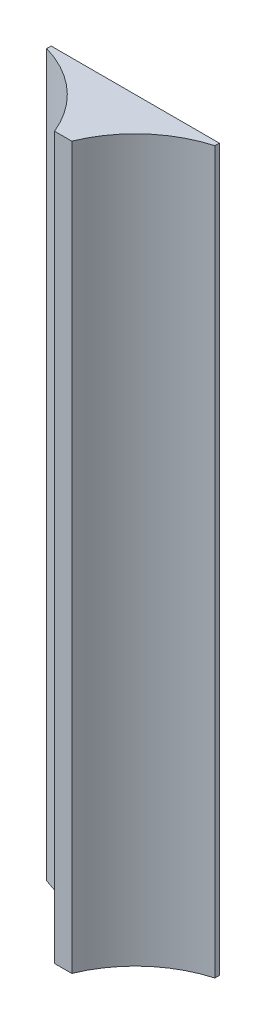
ISO-10303-21;
HEADER;
FILE_DESCRIPTION(('STEP AP214'),'2;1');
FILE_NAME('part.step','',(''),(''),'','','');
FILE_SCHEMA(('AUTOMOTIVE_DESIGN { 1 0 10303 214 1 1 1 1 }'));
ENDSEC;
DATA;
#1=APPLICATION_CONTEXT('core data for automotive mechanical design processes');
#2=APPLICATION_PROTOCOL_DEFINITION('international standard','automotive_design',2000,#1);
#3=PRODUCT_CONTEXT('',#1,'mechanical');
#4=PRODUCT('Part','Part','',(#3));
#5=PRODUCT_RELATED_PRODUCT_CATEGORY('part','',(#4));
#6=PRODUCT_DEFINITION_FORMATION('','',#4);
#7=PRODUCT_DEFINITION_CONTEXT('part definition',#1,'design');
#8=PRODUCT_DEFINITION('design','',#6,#7);
#9=PRODUCT_DEFINITION_SHAPE('','',#8);
#10=(LENGTH_UNIT() NAMED_UNIT(*) SI_UNIT(.MILLI.,.METRE.));
#11=(NAMED_UNIT(*) PLANE_ANGLE_UNIT() SI_UNIT($,.RADIAN.));
#12=(NAMED_UNIT(*) SI_UNIT($,.STERADIAN.) SOLID_ANGLE_UNIT());
#13=UNCERTAINTY_MEASURE_WITH_UNIT(LENGTH_MEASURE(1.E-05),#10,'distance_accuracy_value','');
#14=(GEOMETRIC_REPRESENTATION_CONTEXT(3) GLOBAL_UNCERTAINTY_ASSIGNED_CONTEXT((#13)) GLOBAL_UNIT_ASSIGNED_CONTEXT((#10,
#11,#12)) REPRESENTATION_CONTEXT('',''));
#15=CARTESIAN_POINT('',(0.,0.,0.));
#16=DIRECTION('',(0.,0.,1.));
#17=DIRECTION('',(1.,0.,0.));
#18=AXIS2_PLACEMENT_3D('',#15,#16,#17);
#19=CARTESIAN_POINT('',(-9.65,60.,3.65));
#20=DIRECTION('',(0.,-1.,0.));
#21=DIRECTION('',(0.,0.,-1.));
#22=AXIS2_PLACEMENT_3D('',#19,#20,#21);
#23=CYLINDRICAL_SURFACE('',#22,9.65);
#24=CARTESIAN_POINT('',(-9.65,0.,3.65));
#25=DIRECTION('',(0.,-1.,0.));
#26=DIRECTION('',(0.,0.,-1.));
#27=AXIS2_PLACEMENT_3D('',#24,#25,#26);
#28=CIRCLE('',#27,9.65);
#29=CARTESIAN_POINT('',(-7.,0.,-5.62900856772964));
#30=VERTEX_POINT('',#29);
#31=CARTESIAN_POINT('',(-0.716915426349083,0.,0.));
#32=VERTEX_POINT('',#31);
#33=EDGE_CURVE('E128',#30,#32,#28,.T.);
#34=ORIENTED_EDGE('',*,*,#33,.T.);
#35=DIRECTION('',(0.,-1.,0.));
#36=VECTOR('',#35,1.);
#37=CARTESIAN_POINT('',(-0.716915426349083,60.,0.));
#38=LINE('',#37,#36);
#39=CARTESIAN_POINT('',(-0.716915426349083,60.,0.));
#40=VERTEX_POINT('',#39);
#41=EDGE_CURVE('E11',#40,#32,#38,.T.);
#42=ORIENTED_EDGE('',*,*,#41,.F.);
#43=CARTESIAN_POINT('',(-9.65,60.,3.65));
#44=DIRECTION('',(0.,-1.,0.));
#45=DIRECTION('',(0.,0.,-1.));
#46=AXIS2_PLACEMENT_3D('',#43,#44,#45);
#47=CIRCLE('',#46,9.65);
#48=CARTESIAN_POINT('',(-7.,60.,-5.62900856772964));
#49=VERTEX_POINT('',#48);
#50=EDGE_CURVE('E144',#49,#40,#47,.T.);
#51=ORIENTED_EDGE('',*,*,#50,.F.);
#52=DIRECTION('',(0.,-1.,0.));
#53=VECTOR('',#52,1.);
#54=CARTESIAN_POINT('',(-7.,60.,-5.62900856772964));
#55=LINE('',#54,#53);
#56=EDGE_CURVE('E124',#49,#30,#55,.T.);
#57=ORIENTED_EDGE('',*,*,#56,.T.);
#58=EDGE_LOOP('',(#34,#42,#51,#57));
#59=FACE_BOUND('',#58,.T.);
#60=ADVANCED_FACE('F39',(#59),#23,.F.);
#61=CARTESIAN_POINT('',(-0.716915426349083,60.,0.));
#62=DIRECTION('',(0.,0.,-1.));
#63=DIRECTION('',(-1.,0.,0.));
#64=AXIS2_PLACEMENT_3D('',#61,#62,#63);
#65=PLANE('',#64);
#66=DIRECTION('',(1.,0.,0.));
#67=VECTOR('',#66,1.);
#68=CARTESIAN_POINT('',(-0.716915426349083,0.,0.));
#69=LINE('',#68,#67);
#70=CARTESIAN_POINT('',(0.71691542634908,0.,0.));
#71=VERTEX_POINT('',#70);
#72=EDGE_CURVE('E132',#32,#71,#69,.T.);
#73=ORIENTED_EDGE('',*,*,#72,.T.);
#74=DIRECTION('',(0.,-1.,0.));
#75=VECTOR('',#74,1.);
#76=CARTESIAN_POINT('',(0.71691542634908,60.,0.));
#77=LINE('',#76,#75);
#78=CARTESIAN_POINT('',(0.71691542634908,60.,0.));
#79=VERTEX_POINT('',#78);
#80=EDGE_CURVE('E48',#79,#71,#77,.T.);
#81=ORIENTED_EDGE('',*,*,#80,.F.);
#82=DIRECTION('',(1.,0.,0.));
#83=VECTOR('',#82,1.);
#84=CARTESIAN_POINT('',(-0.716915426349083,60.,0.));
#85=LINE('',#84,#83);
#86=EDGE_CURVE('E93',#40,#79,#85,.T.);
#87=ORIENTED_EDGE('',*,*,#86,.F.);
#88=ORIENTED_EDGE('',*,*,#41,.T.);
#89=EDGE_LOOP('',(#73,#81,#87,#88));
#90=FACE_BOUND('',#89,.T.);
#91=ADVANCED_FACE('F172',(#90),#65,.F.);
#92=CARTESIAN_POINT('',(9.65,60.,3.65));
#93=DIRECTION('',(0.,-1.,0.));
#94=DIRECTION('',(0.,0.,-1.));
#95=AXIS2_PLACEMENT_3D('',#92,#93,#94);
#96=CYLINDRICAL_SURFACE('',#95,9.65);
#97=CARTESIAN_POINT('',(9.65,0.,3.65));
#98=DIRECTION('',(0.,-1.,0.));
#99=DIRECTION('',(0.,0.,-1.));
#100=AXIS2_PLACEMENT_3D('',#97,#98,#99);
#101=CIRCLE('',#100,9.65);
#102=CARTESIAN_POINT('',(7.,0.,-5.62900856772964));
#103=VERTEX_POINT('',#102);
#104=EDGE_CURVE('E135',#71,#103,#101,.T.);
#105=ORIENTED_EDGE('',*,*,#104,.T.);
#106=DIRECTION('',(0.,-1.,0.));
#107=VECTOR('',#106,1.);
#108=CARTESIAN_POINT('',(7.,60.,-5.62900856772964));
#109=LINE('',#108,#107);
#110=CARTESIAN_POINT('',(7.,60.,-5.62900856772964));
#111=VERTEX_POINT('',#110);
#112=EDGE_CURVE('E117',#111,#103,#109,.T.);
#113=ORIENTED_EDGE('',*,*,#112,.F.);
#114=CARTESIAN_POINT('',(9.65,60.,3.65));
#115=DIRECTION('',(0.,-1.,0.));
#116=DIRECTION('',(0.,0.,-1.));
#117=AXIS2_PLACEMENT_3D('',#114,#115,#116);
#118=CIRCLE('',#117,9.65);
#119=EDGE_CURVE('E106',#79,#111,#118,.T.);
#120=ORIENTED_EDGE('',*,*,#119,.F.);
#121=ORIENTED_EDGE('',*,*,#80,.T.);
#122=EDGE_LOOP('',(#105,#113,#120,#121));
#123=FACE_BOUND('',#122,.T.);
#124=ADVANCED_FACE('F154',(#123),#96,.F.);
#125=CARTESIAN_POINT('',(7.,60.,-5.62900856772964));
#126=DIRECTION('',(-1.,0.,0.));
#127=DIRECTION('',(0.,0.,1.));
#128=AXIS2_PLACEMENT_3D('',#125,#126,#127);
#129=PLANE('',#128);
#130=DIRECTION('',(0.,0.,-1.));
#131=VECTOR('',#130,1.);
#132=CARTESIAN_POINT('',(7.,0.,-5.62900856772964));
#133=LINE('',#132,#131);
#134=CARTESIAN_POINT('',(7.,0.,-6.));
#135=VERTEX_POINT('',#134);
#136=EDGE_CURVE('E115',#103,#135,#133,.T.);
#137=ORIENTED_EDGE('',*,*,#136,.T.);
#138=DIRECTION('',(0.,-1.,0.));
#139=VECTOR('',#138,1.);
#140=CARTESIAN_POINT('',(7.,60.,-6.));
#141=LINE('',#140,#139);
#142=CARTESIAN_POINT('',(7.,60.,-6.));
#143=VERTEX_POINT('',#142);
#144=EDGE_CURVE('E112',#143,#135,#141,.T.);
#145=ORIENTED_EDGE('',*,*,#144,.F.);
#146=DIRECTION('',(0.,0.,-1.));
#147=VECTOR('',#146,1.);
#148=CARTESIAN_POINT('',(7.,60.,-5.62900856772964));
#149=LINE('',#148,#147);
#150=EDGE_CURVE('E100',#111,#143,#149,.T.);
#151=ORIENTED_EDGE('',*,*,#150,.F.);
#152=ORIENTED_EDGE('',*,*,#112,.T.);
#153=EDGE_LOOP('',(#137,#145,#151,#152));
#154=FACE_BOUND('',#153,.T.);
#155=ADVANCED_FACE('F113',(#154),#129,.F.);
#156=CARTESIAN_POINT('',(7.,60.,-6.));
#157=DIRECTION('',(0.,0.,1.));
#158=DIRECTION('',(1.,0.,0.));
#159=AXIS2_PLACEMENT_3D('',#156,#157,#158);
#160=PLANE('',#159);
#161=DIRECTION('',(-1.,0.,0.));
#162=VECTOR('',#161,1.);
#163=CARTESIAN_POINT('',(7.,0.,-6.));
#164=LINE('',#163,#162);
#165=CARTESIAN_POINT('',(-7.,0.,-6.));
#166=VERTEX_POINT('',#165);
#167=EDGE_CURVE('E79',#135,#166,#164,.T.);
#168=ORIENTED_EDGE('',*,*,#167,.T.);
#169=DIRECTION('',(0.,-1.,0.));
#170=VECTOR('',#169,1.);
#171=CARTESIAN_POINT('',(-7.,60.,-6.));
#172=LINE('',#171,#170);
#173=CARTESIAN_POINT('',(-7.,60.,-6.));
#174=VERTEX_POINT('',#173);
#175=EDGE_CURVE('E118',#174,#166,#172,.T.);
#176=ORIENTED_EDGE('',*,*,#175,.F.);
#177=DIRECTION('',(-1.,0.,0.));
#178=VECTOR('',#177,1.);
#179=CARTESIAN_POINT('',(7.,60.,-6.));
#180=LINE('',#179,#178);
#181=EDGE_CURVE('E104',#143,#174,#180,.T.);
#182=ORIENTED_EDGE('',*,*,#181,.F.);
#183=ORIENTED_EDGE('',*,*,#144,.T.);
#184=EDGE_LOOP('',(#168,#176,#182,#183));
#185=FACE_BOUND('',#184,.T.);
#186=ADVANCED_FACE('F120',(#185),#160,.F.);
#187=CARTESIAN_POINT('',(-7.,60.,-6.));
#188=DIRECTION('',(1.,0.,0.));
#189=DIRECTION('',(0.,0.,-1.));
#190=AXIS2_PLACEMENT_3D('',#187,#188,#189);
#191=PLANE('',#190);
#192=DIRECTION('',(0.,0.,1.));
#193=VECTOR('',#192,1.);
#194=CARTESIAN_POINT('',(-7.,0.,-6.));
#195=LINE('',#194,#193);
#196=EDGE_CURVE('E85',#166,#30,#195,.T.);
#197=ORIENTED_EDGE('',*,*,#196,.T.);
#198=ORIENTED_EDGE('',*,*,#56,.F.);
#199=DIRECTION('',(0.,0.,1.));
#200=VECTOR('',#199,1.);
#201=CARTESIAN_POINT('',(-7.,60.,-6.));
#202=LINE('',#201,#200);
#203=EDGE_CURVE('E56',#174,#49,#202,.T.);
#204=ORIENTED_EDGE('',*,*,#203,.F.);
#205=ORIENTED_EDGE('',*,*,#175,.T.);
#206=EDGE_LOOP('',(#197,#198,#204,#205));
#207=FACE_BOUND('',#206,.T.);
#208=ADVANCED_FACE('F161',(#207),#191,.F.);
#209=CARTESIAN_POINT('',(-9.65,60.,3.65));
#210=DIRECTION('',(0.,-1.,0.));
#211=DIRECTION('',(0.,0.,-1.));
#212=AXIS2_PLACEMENT_3D('',#209,#210,#211);
#213=PLANE('',#212);
#214=ORIENTED_EDGE('',*,*,#50,.T.);
#215=ORIENTED_EDGE('',*,*,#86,.T.);
#216=ORIENTED_EDGE('',*,*,#119,.T.);
#217=ORIENTED_EDGE('',*,*,#150,.T.);
#218=ORIENTED_EDGE('',*,*,#181,.T.);
#219=ORIENTED_EDGE('',*,*,#203,.T.);
#220=EDGE_LOOP('',(#214,#215,#216,#217,#218,#219));
#221=FACE_BOUND('',#220,.T.);
#222=ADVANCED_FACE('F102',(#221),#213,.F.);
#223=CARTESIAN_POINT('',(-9.65,0.,3.65));
#224=DIRECTION('',(0.,-1.,0.));
#225=DIRECTION('',(0.,0.,-1.));
#226=AXIS2_PLACEMENT_3D('',#223,#224,#225);
#227=PLANE('',#226);
#228=ORIENTED_EDGE('',*,*,#33,.F.);
#229=ORIENTED_EDGE('',*,*,#196,.F.);
#230=ORIENTED_EDGE('',*,*,#167,.F.);
#231=ORIENTED_EDGE('',*,*,#136,.F.);
#232=ORIENTED_EDGE('',*,*,#104,.F.);
#233=ORIENTED_EDGE('',*,*,#72,.F.);
#234=EDGE_LOOP('',(#228,#229,#230,#231,#232,#233));
#235=FACE_BOUND('',#234,.T.);
#236=ADVANCED_FACE('F157',(#235),#227,.T.);
#237=CLOSED_SHELL('',(#60,#91,#124,#155,#186,#208,#222,#236));
#238=MANIFOLD_SOLID_BREP('B2',#237);
#239=ADVANCED_BREP_SHAPE_REPRESENTATION('',(#18,#238),#14);
#240=SHAPE_DEFINITION_REPRESENTATION(#9,#239);
ENDSEC;
END-ISO-10303-21;
